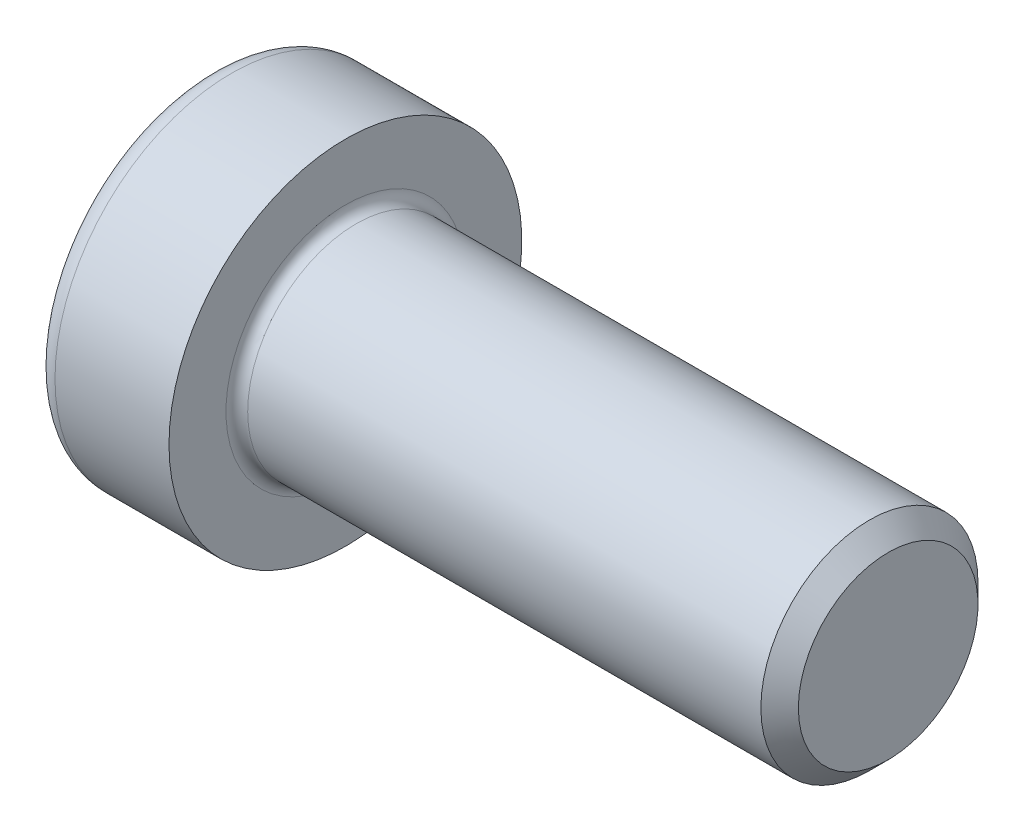
ISO-10303-21;
HEADER;
FILE_DESCRIPTION(('STEP AP214'),'2;1');
FILE_NAME('part.step','',(''),(''),'','','');
FILE_SCHEMA(('AUTOMOTIVE_DESIGN { 1 0 10303 214 1 1 1 1 }'));
ENDSEC;
DATA;
#1=APPLICATION_CONTEXT('core data for automotive mechanical design processes');
#2=APPLICATION_PROTOCOL_DEFINITION('international standard','automotive_design',2000,#1);
#3=PRODUCT_CONTEXT('',#1,'mechanical');
#4=PRODUCT('Part','Part','',(#3));
#5=PRODUCT_RELATED_PRODUCT_CATEGORY('part','',(#4));
#6=PRODUCT_DEFINITION_FORMATION('','',#4);
#7=PRODUCT_DEFINITION_CONTEXT('part definition',#1,'design');
#8=PRODUCT_DEFINITION('design','',#6,#7);
#9=PRODUCT_DEFINITION_SHAPE('','',#8);
#10=(LENGTH_UNIT() NAMED_UNIT(*) SI_UNIT(.MILLI.,.METRE.));
#11=(NAMED_UNIT(*) PLANE_ANGLE_UNIT() SI_UNIT($,.RADIAN.));
#12=(NAMED_UNIT(*) SI_UNIT($,.STERADIAN.) SOLID_ANGLE_UNIT());
#13=UNCERTAINTY_MEASURE_WITH_UNIT(LENGTH_MEASURE(1.E-05),#10,'distance_accuracy_value','');
#14=(GEOMETRIC_REPRESENTATION_CONTEXT(3) GLOBAL_UNCERTAINTY_ASSIGNED_CONTEXT((#13)) GLOBAL_UNIT_ASSIGNED_CONTEXT((#10,
#11,#12)) REPRESENTATION_CONTEXT('',''));
#15=CARTESIAN_POINT('',(0.,0.,0.));
#16=DIRECTION('',(0.,0.,1.));
#17=DIRECTION('',(1.,0.,0.));
#18=AXIS2_PLACEMENT_3D('',#15,#16,#17);
#19=CARTESIAN_POINT('',(0.,0.,0.));
#20=DIRECTION('',(-1.,0.,0.));
#21=DIRECTION('',(0.,0.,1.));
#22=AXIS2_PLACEMENT_3D('',#19,#20,#21);
#23=PLANE('',#22);
#24=DIRECTION('',(0.,-0.499999999999998,0.86602540378444));
#25=VECTOR('',#24,1.);
#26=CARTESIAN_POINT('',(0.,2.88675134594813,0.));
#27=LINE('',#26,#25);
#28=CARTESIAN_POINT('',(0.,2.88675134594813,0.));
#29=VERTEX_POINT('',#28);
#30=CARTESIAN_POINT('',(0.,1.44337567297407,2.49999999999999));
#31=VERTEX_POINT('',#30);
#32=EDGE_CURVE('E296',#29,#31,#27,.T.);
#33=ORIENTED_EDGE('',*,*,#32,.T.);
#34=DIRECTION('',(0.,1.,0.));
#35=VECTOR('',#34,1.);
#36=CARTESIAN_POINT('',(0.,-1.44337567297405,2.5));
#37=LINE('',#36,#35);
#38=CARTESIAN_POINT('',(0.,-1.44337567297405,2.5));
#39=VERTEX_POINT('',#38);
#40=EDGE_CURVE('E150',#39,#31,#37,.T.);
#41=ORIENTED_EDGE('',*,*,#40,.F.);
#42=DIRECTION('',(0.,-0.500000000000001,-0.866025403784438));
#43=VECTOR('',#42,1.);
#44=CARTESIAN_POINT('',(0.,-1.44337567297405,2.5));
#45=LINE('',#44,#43);
#46=CARTESIAN_POINT('',(0.,-2.88675134594812,0.));
#47=VERTEX_POINT('',#46);
#48=EDGE_CURVE('E301',#39,#47,#45,.T.);
#49=ORIENTED_EDGE('',*,*,#48,.T.);
#50=DIRECTION('',(0.,0.499999999999998,-0.86602540378444));
#51=VECTOR('',#50,1.);
#52=CARTESIAN_POINT('',(0.,-2.88675134594812,0.));
#53=LINE('',#52,#51);
#54=CARTESIAN_POINT('',(0.,-1.44337567297406,-2.5));
#55=VERTEX_POINT('',#54);
#56=EDGE_CURVE('E305',#47,#55,#53,.T.);
#57=ORIENTED_EDGE('',*,*,#56,.T.);
#58=DIRECTION('',(0.,-1.,0.));
#59=VECTOR('',#58,1.);
#60=CARTESIAN_POINT('',(0.,1.44337567297407,-2.50000000000001));
#61=LINE('',#60,#59);
#62=CARTESIAN_POINT('',(0.,1.44337567297407,-2.50000000000001));
#63=VERTEX_POINT('',#62);
#64=EDGE_CURVE('E309',#63,#55,#61,.T.);
#65=ORIENTED_EDGE('',*,*,#64,.F.);
#66=DIRECTION('',(0.,-0.500000000000001,-0.866025403784438));
#67=VECTOR('',#66,1.);
#68=CARTESIAN_POINT('',(0.,2.88675134594813,0.));
#69=LINE('',#68,#67);
#70=EDGE_CURVE('E145',#29,#63,#69,.T.);
#71=ORIENTED_EDGE('',*,*,#70,.F.);
#72=EDGE_LOOP('',(#33,#41,#49,#57,#65,#71));
#73=FACE_BOUND('',#72,.T.);
#74=CARTESIAN_POINT('',(0.,0.,0.));
#75=DIRECTION('',(-1.,0.,0.));
#76=DIRECTION('',(0.,0.,1.));
#77=AXIS2_PLACEMENT_3D('',#74,#75,#76);
#78=CIRCLE('',#77,5.7);
#79=CARTESIAN_POINT('',(0.,0.,5.7));
#80=VERTEX_POINT('',#79);
#81=EDGE_CURVE('E60',#80,#80,#78,.T.);
#82=ORIENTED_EDGE('',*,*,#81,.T.);
#83=EDGE_LOOP('',(#82));
#84=FACE_BOUND('',#83,.T.);
#85=ADVANCED_FACE('F51',(#73,#84),#23,.T.);
#86=CARTESIAN_POINT('',(-31.75,0.,0.));
#87=DIRECTION('',(-1.,0.,0.));
#88=DIRECTION('',(0.,0.,1.));
#89=AXIS2_PLACEMENT_3D('',#86,#87,#88);
#90=CYLINDRICAL_SURFACE('',#89,6.5);
#91=CARTESIAN_POINT('',(0.800000000000002,0.,0.));
#92=DIRECTION('',(-1.,0.,0.));
#93=DIRECTION('',(0.,0.,1.));
#94=AXIS2_PLACEMENT_3D('',#91,#92,#93);
#95=CIRCLE('',#94,6.5);
#96=CARTESIAN_POINT('',(0.800000000000002,0.,6.5));
#97=VERTEX_POINT('',#96);
#98=EDGE_CURVE('E11',#97,#97,#95,.F.);
#99=ORIENTED_EDGE('',*,*,#98,.T.);
#100=EDGE_LOOP('',(#99));
#101=FACE_BOUND('',#100,.T.);
#102=CARTESIAN_POINT('',(5.,0.,0.));
#103=DIRECTION('',(-1.,0.,0.));
#104=DIRECTION('',(0.,0.,1.));
#105=AXIS2_PLACEMENT_3D('',#102,#103,#104);
#106=CIRCLE('',#105,6.5);
#107=CARTESIAN_POINT('',(5.,0.,6.5));
#108=VERTEX_POINT('',#107);
#109=EDGE_CURVE('E175',#108,#108,#106,.T.);
#110=ORIENTED_EDGE('',*,*,#109,.T.);
#111=EDGE_LOOP('',(#110));
#112=FACE_BOUND('',#111,.T.);
#113=ADVANCED_FACE('F204',(#101,#112),#90,.T.);
#114=CARTESIAN_POINT('',(5.,6.5,0.));
#115=DIRECTION('',(1.,0.,0.));
#116=DIRECTION('',(0.,0.,-1.));
#117=AXIS2_PLACEMENT_3D('',#114,#115,#116);
#118=PLANE('',#117);
#119=CARTESIAN_POINT('',(5.,0.,0.));
#120=DIRECTION('',(1.,0.,0.));
#121=DIRECTION('',(0.,0.,-1.));
#122=AXIS2_PLACEMENT_3D('',#119,#120,#121);
#123=CIRCLE('',#122,4.39999999999989);
#124=CARTESIAN_POINT('',(5.,0.,-4.39999999999989));
#125=VERTEX_POINT('',#124);
#126=EDGE_CURVE('E179',#125,#125,#123,.F.);
#127=ORIENTED_EDGE('',*,*,#126,.T.);
#128=EDGE_LOOP('',(#127));
#129=FACE_BOUND('',#128,.T.);
#130=ORIENTED_EDGE('',*,*,#109,.F.);
#131=EDGE_LOOP('',(#130));
#132=FACE_BOUND('',#131,.T.);
#133=ADVANCED_FACE('F210',(#129,#132),#118,.T.);
#134=CARTESIAN_POINT('',(-31.75,0.,0.));
#135=DIRECTION('',(-1.,0.,0.));
#136=DIRECTION('',(0.,0.,1.));
#137=AXIS2_PLACEMENT_3D('',#134,#135,#136);
#138=CYLINDRICAL_SURFACE('',#137,3.99999999999989);
#139=CARTESIAN_POINT('',(5.4,0.,0.));
#140=DIRECTION('',(1.,0.,0.));
#141=DIRECTION('',(0.,0.,-1.));
#142=AXIS2_PLACEMENT_3D('',#139,#140,#141);
#143=CIRCLE('',#142,3.99999999999989);
#144=CARTESIAN_POINT('',(5.4,0.,-3.99999999999989));
#145=VERTEX_POINT('',#144);
#146=EDGE_CURVE('E183',#145,#145,#143,.T.);
#147=ORIENTED_EDGE('',*,*,#146,.T.);
#148=EDGE_LOOP('',(#147));
#149=FACE_BOUND('',#148,.T.);
#150=CARTESIAN_POINT('',(24.3094999999998,0.,0.));
#151=DIRECTION('',(-1.,0.,0.));
#152=DIRECTION('',(0.,0.,1.));
#153=AXIS2_PLACEMENT_3D('',#150,#151,#152);
#154=CIRCLE('',#153,3.99999999999978);
#155=CARTESIAN_POINT('',(24.3094999999998,0.,3.99999999999978));
#156=VERTEX_POINT('',#155);
#157=EDGE_CURVE('E171',#156,#156,#154,.T.);
#158=ORIENTED_EDGE('',*,*,#157,.T.);
#159=EDGE_LOOP('',(#158));
#160=FACE_BOUND('',#159,.T.);
#161=ADVANCED_FACE('F216',(#149,#160),#138,.T.);
#162=CARTESIAN_POINT('',(25.,0.,0.));
#163=DIRECTION('',(-1.,0.,0.));
#164=DIRECTION('',(0.,0.,1.));
#165=AXIS2_PLACEMENT_3D('',#162,#163,#164);
#166=CONICAL_SURFACE('',#165,3.3095,0.785398163397146);
#167=ORIENTED_EDGE('',*,*,#157,.F.);
#168=EDGE_LOOP('',(#167));
#169=FACE_BOUND('',#168,.T.);
#170=CARTESIAN_POINT('',(25.,0.,0.));
#171=DIRECTION('',(-1.,0.,0.));
#172=DIRECTION('',(0.,0.,1.));
#173=AXIS2_PLACEMENT_3D('',#170,#171,#172);
#174=CIRCLE('',#173,3.3095);
#175=CARTESIAN_POINT('',(25.,0.,3.3095));
#176=VERTEX_POINT('',#175);
#177=EDGE_CURVE('E166',#176,#176,#174,.T.);
#178=ORIENTED_EDGE('',*,*,#177,.T.);
#179=EDGE_LOOP('',(#178));
#180=FACE_BOUND('',#179,.T.);
#181=ADVANCED_FACE('F220',(#169,#180),#166,.T.);
#182=CARTESIAN_POINT('',(25.,3.3095,0.));
#183=DIRECTION('',(1.,0.,0.));
#184=DIRECTION('',(0.,0.,-1.));
#185=AXIS2_PLACEMENT_3D('',#182,#183,#184);
#186=PLANE('',#185);
#187=ORIENTED_EDGE('',*,*,#177,.F.);
#188=EDGE_LOOP('',(#187));
#189=FACE_BOUND('',#188,.T.);
#190=ADVANCED_FACE('F200',(#189),#186,.T.);
#191=CARTESIAN_POINT('',(5.4,0.,0.));
#192=DIRECTION('',(1.,0.,0.));
#193=DIRECTION('',(0.,0.,-1.));
#194=AXIS2_PLACEMENT_3D('',#191,#192,#193);
#195=TOROIDAL_SURFACE('',#194,4.39999999999989,0.4);
#196=ORIENTED_EDGE('',*,*,#146,.F.);
#197=EDGE_LOOP('',(#196));
#198=FACE_BOUND('',#197,.T.);
#199=ORIENTED_EDGE('',*,*,#126,.F.);
#200=EDGE_LOOP('',(#199));
#201=FACE_BOUND('',#200,.T.);
#202=ADVANCED_FACE('F193',(#198,#201),#195,.F.);
#203=CARTESIAN_POINT('',(0.800000000000002,0.,0.));
#204=DIRECTION('',(-1.,0.,0.));
#205=DIRECTION('',(0.,0.,1.));
#206=AXIS2_PLACEMENT_3D('',#203,#204,#205);
#207=TOROIDAL_SURFACE('',#206,5.7,0.8);
#208=ORIENTED_EDGE('',*,*,#98,.F.);
#209=EDGE_LOOP('',(#208));
#210=FACE_BOUND('',#209,.T.);
#211=ORIENTED_EDGE('',*,*,#81,.F.);
#212=EDGE_LOOP('',(#211));
#213=FACE_BOUND('',#212,.T.);
#214=ADVANCED_FACE('F53',(#210,#213),#207,.T.);
#215=CARTESIAN_POINT('',(3.8,2.88675134594813,0.));
#216=DIRECTION('',(0.,-0.86602540378444,-0.499999999999998));
#217=DIRECTION('',(0.,0.499999999999998,-0.86602540378444));
#218=AXIS2_PLACEMENT_3D('',#215,#216,#217);
#219=PLANE('',#218);
#220=ORIENTED_EDGE('',*,*,#32,.F.);
#221=DIRECTION('',(-1.,0.,0.));
#222=VECTOR('',#221,1.);
#223=CARTESIAN_POINT('',(3.8,2.88675134594813,0.));
#224=LINE('',#223,#222);
#225=CARTESIAN_POINT('',(3.8,2.88675134594813,0.));
#226=VERTEX_POINT('',#225);
#227=EDGE_CURVE('E282',#226,#29,#224,.T.);
#228=ORIENTED_EDGE('',*,*,#227,.F.);
#229=DIRECTION('',(0.,-0.499999999999998,0.86602540378444));
#230=VECTOR('',#229,1.);
#231=CARTESIAN_POINT('',(3.8,2.88675134594813,0.));
#232=LINE('',#231,#230);
#233=CARTESIAN_POINT('',(3.8,2.1650635094611,1.24999999999999));
#234=VERTEX_POINT('',#233);
#235=EDGE_CURVE('E136',#226,#234,#232,.T.);
#236=ORIENTED_EDGE('',*,*,#235,.T.);
#237=CARTESIAN_POINT('',(3.8,1.44337567297407,2.49999999999999));
#238=VERTEX_POINT('',#237);
#239=EDGE_CURVE('E126',#234,#238,#232,.T.);
#240=ORIENTED_EDGE('',*,*,#239,.T.);
#241=DIRECTION('',(-1.,0.,0.));
#242=VECTOR('',#241,1.);
#243=CARTESIAN_POINT('',(3.8,1.44337567297407,2.49999999999999));
#244=LINE('',#243,#242);
#245=EDGE_CURVE('E141',#238,#31,#244,.T.);
#246=ORIENTED_EDGE('',*,*,#245,.T.);
#247=EDGE_LOOP('',(#220,#228,#236,#240,#246));
#248=FACE_BOUND('',#247,.T.);
#249=ADVANCED_FACE('F140',(#248),#219,.T.);
#250=CARTESIAN_POINT('',(3.8,-1.44337567297405,2.5));
#251=DIRECTION('',(0.,0.,1.));
#252=DIRECTION('',(0.,-1.,0.));
#253=AXIS2_PLACEMENT_3D('',#250,#251,#252);
#254=PLANE('',#253);
#255=ORIENTED_EDGE('',*,*,#40,.T.);
#256=ORIENTED_EDGE('',*,*,#245,.F.);
#257=DIRECTION('',(0.,1.,0.));
#258=VECTOR('',#257,1.);
#259=CARTESIAN_POINT('',(3.8,-1.44337567297405,2.5));
#260=LINE('',#259,#258);
#261=CARTESIAN_POINT('',(3.8,0.,2.49999999999999));
#262=VERTEX_POINT('',#261);
#263=EDGE_CURVE('E123',#262,#238,#260,.T.);
#264=ORIENTED_EDGE('',*,*,#263,.F.);
#265=CARTESIAN_POINT('',(3.8,-1.44337567297405,2.5));
#266=VERTEX_POINT('',#265);
#267=EDGE_CURVE('E135',#266,#262,#260,.T.);
#268=ORIENTED_EDGE('',*,*,#267,.F.);
#269=DIRECTION('',(-1.,0.,0.));
#270=VECTOR('',#269,1.);
#271=CARTESIAN_POINT('',(3.8,-1.44337567297405,2.5));
#272=LINE('',#271,#270);
#273=EDGE_CURVE('E153',#266,#39,#272,.T.);
#274=ORIENTED_EDGE('',*,*,#273,.T.);
#275=EDGE_LOOP('',(#255,#256,#264,#268,#274));
#276=FACE_BOUND('',#275,.T.);
#277=ADVANCED_FACE('F147',(#276),#254,.F.);
#278=CARTESIAN_POINT('',(3.8,-1.44337567297405,2.5));
#279=DIRECTION('',(0.,0.866025403784438,-0.500000000000001));
#280=DIRECTION('',(0.,0.500000000000001,0.866025403784438));
#281=AXIS2_PLACEMENT_3D('',#278,#279,#280);
#282=PLANE('',#281);
#283=ORIENTED_EDGE('',*,*,#48,.F.);
#284=ORIENTED_EDGE('',*,*,#273,.F.);
#285=DIRECTION('',(0.,-0.500000000000001,-0.866025403784438));
#286=VECTOR('',#285,1.);
#287=CARTESIAN_POINT('',(3.8,-1.44337567297405,2.5));
#288=LINE('',#287,#286);
#289=CARTESIAN_POINT('',(3.8,-2.16506350946108,1.25));
#290=VERTEX_POINT('',#289);
#291=EDGE_CURVE('E344',#266,#290,#288,.T.);
#292=ORIENTED_EDGE('',*,*,#291,.T.);
#293=CARTESIAN_POINT('',(3.8,-2.88675134594812,0.));
#294=VERTEX_POINT('',#293);
#295=EDGE_CURVE('E324',#290,#294,#288,.T.);
#296=ORIENTED_EDGE('',*,*,#295,.T.);
#297=DIRECTION('',(-1.,0.,0.));
#298=VECTOR('',#297,1.);
#299=CARTESIAN_POINT('',(3.8,-2.88675134594812,0.));
#300=LINE('',#299,#298);
#301=EDGE_CURVE('E161',#294,#47,#300,.T.);
#302=ORIENTED_EDGE('',*,*,#301,.T.);
#303=EDGE_LOOP('',(#283,#284,#292,#296,#302));
#304=FACE_BOUND('',#303,.T.);
#305=ADVANCED_FACE('F234',(#304),#282,.T.);
#306=CARTESIAN_POINT('',(3.8,-2.88675134594812,0.));
#307=DIRECTION('',(0.,0.86602540378444,0.499999999999998));
#308=DIRECTION('',(0.,-0.499999999999998,0.86602540378444));
#309=AXIS2_PLACEMENT_3D('',#306,#307,#308);
#310=PLANE('',#309);
#311=ORIENTED_EDGE('',*,*,#56,.F.);
#312=ORIENTED_EDGE('',*,*,#301,.F.);
#313=DIRECTION('',(0.,0.499999999999998,-0.86602540378444));
#314=VECTOR('',#313,1.);
#315=CARTESIAN_POINT('',(3.8,-2.88675134594812,0.));
#316=LINE('',#315,#314);
#317=CARTESIAN_POINT('',(3.8,-2.1650635094611,-1.24999999999999));
#318=VERTEX_POINT('',#317);
#319=EDGE_CURVE('E291',#294,#318,#316,.T.);
#320=ORIENTED_EDGE('',*,*,#319,.T.);
#321=CARTESIAN_POINT('',(3.8,-1.44337567297406,-2.5));
#322=VERTEX_POINT('',#321);
#323=EDGE_CURVE('E342',#318,#322,#316,.T.);
#324=ORIENTED_EDGE('',*,*,#323,.T.);
#325=DIRECTION('',(-1.,0.,0.));
#326=VECTOR('',#325,1.);
#327=CARTESIAN_POINT('',(3.8,-1.44337567297406,-2.5));
#328=LINE('',#327,#326);
#329=EDGE_CURVE('E281',#322,#55,#328,.T.);
#330=ORIENTED_EDGE('',*,*,#329,.T.);
#331=EDGE_LOOP('',(#311,#312,#320,#324,#330));
#332=FACE_BOUND('',#331,.T.);
#333=ADVANCED_FACE('F237',(#332),#310,.T.);
#334=CARTESIAN_POINT('',(3.8,1.44337567297407,-2.50000000000001));
#335=DIRECTION('',(0.,0.,-1.));
#336=DIRECTION('',(0.,1.,0.));
#337=AXIS2_PLACEMENT_3D('',#334,#335,#336);
#338=PLANE('',#337);
#339=ORIENTED_EDGE('',*,*,#64,.T.);
#340=ORIENTED_EDGE('',*,*,#329,.F.);
#341=DIRECTION('',(0.,-1.,0.));
#342=VECTOR('',#341,1.);
#343=CARTESIAN_POINT('',(3.8,1.44337567297407,-2.50000000000001));
#344=LINE('',#343,#342);
#345=CARTESIAN_POINT('',(3.8,0.,-2.5));
#346=VERTEX_POINT('',#345);
#347=EDGE_CURVE('E285',#346,#322,#344,.T.);
#348=ORIENTED_EDGE('',*,*,#347,.F.);
#349=CARTESIAN_POINT('',(3.8,1.44337567297407,-2.50000000000001));
#350=VERTEX_POINT('',#349);
#351=EDGE_CURVE('E67',#350,#346,#344,.T.);
#352=ORIENTED_EDGE('',*,*,#351,.F.);
#353=DIRECTION('',(-1.,0.,0.));
#354=VECTOR('',#353,1.);
#355=CARTESIAN_POINT('',(3.8,1.44337567297407,-2.50000000000001));
#356=LINE('',#355,#354);
#357=EDGE_CURVE('E277',#350,#63,#356,.T.);
#358=ORIENTED_EDGE('',*,*,#357,.T.);
#359=EDGE_LOOP('',(#339,#340,#348,#352,#358));
#360=FACE_BOUND('',#359,.T.);
#361=ADVANCED_FACE('F241',(#360),#338,.F.);
#362=CARTESIAN_POINT('',(3.8,2.88675134594813,0.));
#363=DIRECTION('',(0.,0.866025403784438,-0.500000000000001));
#364=DIRECTION('',(0.,0.500000000000001,0.866025403784438));
#365=AXIS2_PLACEMENT_3D('',#362,#363,#364);
#366=PLANE('',#365);
#367=ORIENTED_EDGE('',*,*,#70,.T.);
#368=ORIENTED_EDGE('',*,*,#357,.F.);
#369=DIRECTION('',(0.,-0.500000000000001,-0.866025403784438));
#370=VECTOR('',#369,1.);
#371=CARTESIAN_POINT('',(3.8,2.88675134594813,0.));
#372=LINE('',#371,#370);
#373=CARTESIAN_POINT('',(3.8,2.1650635094611,-1.25000000000001));
#374=VERTEX_POINT('',#373);
#375=EDGE_CURVE('E266',#374,#350,#372,.T.);
#376=ORIENTED_EDGE('',*,*,#375,.F.);
#377=EDGE_CURVE('E273',#226,#374,#372,.T.);
#378=ORIENTED_EDGE('',*,*,#377,.F.);
#379=ORIENTED_EDGE('',*,*,#227,.T.);
#380=EDGE_LOOP('',(#367,#368,#376,#378,#379));
#381=FACE_BOUND('',#380,.T.);
#382=ADVANCED_FACE('F245',(#381),#366,.F.);
#383=CARTESIAN_POINT('',(3.8,4.33012701892219,-2.50000000000001));
#384=DIRECTION('',(1.,0.,0.));
#385=DIRECTION('',(0.,0.,-1.));
#386=AXIS2_PLACEMENT_3D('',#383,#384,#385);
#387=PLANE('',#386);
#388=ORIENTED_EDGE('',*,*,#347,.T.);
#389=ORIENTED_EDGE('',*,*,#323,.F.);
#390=CARTESIAN_POINT('',(3.8,0.,0.));
#391=DIRECTION('',(-1.,0.,0.));
#392=DIRECTION('',(0.,0.,1.));
#393=AXIS2_PLACEMENT_3D('',#390,#391,#392);
#394=CIRCLE('',#393,2.5);
#395=EDGE_CURVE('E333',#346,#318,#394,.T.);
#396=ORIENTED_EDGE('',*,*,#395,.F.);
#397=EDGE_LOOP('',(#388,#389,#396));
#398=FACE_BOUND('',#397,.T.);
#399=ADVANCED_FACE('F249',(#398),#387,.F.);
#400=ORIENTED_EDGE('',*,*,#319,.F.);
#401=ORIENTED_EDGE('',*,*,#295,.F.);
#402=EDGE_CURVE('E159',#318,#290,#394,.T.);
#403=ORIENTED_EDGE('',*,*,#402,.F.);
#404=EDGE_LOOP('',(#400,#401,#403));
#405=FACE_BOUND('',#404,.T.);
#406=ADVANCED_FACE('F252',(#405),#387,.F.);
#407=ORIENTED_EDGE('',*,*,#291,.F.);
#408=ORIENTED_EDGE('',*,*,#267,.T.);
#409=EDGE_CURVE('E152',#290,#262,#394,.T.);
#410=ORIENTED_EDGE('',*,*,#409,.F.);
#411=EDGE_LOOP('',(#407,#408,#410));
#412=FACE_BOUND('',#411,.T.);
#413=ADVANCED_FACE('F257',(#412),#387,.F.);
#414=ORIENTED_EDGE('',*,*,#263,.T.);
#415=ORIENTED_EDGE('',*,*,#239,.F.);
#416=EDGE_CURVE('E129',#262,#234,#394,.T.);
#417=ORIENTED_EDGE('',*,*,#416,.F.);
#418=EDGE_LOOP('',(#414,#415,#417));
#419=FACE_BOUND('',#418,.T.);
#420=ADVANCED_FACE('F125',(#419),#387,.F.);
#421=ORIENTED_EDGE('',*,*,#235,.F.);
#422=ORIENTED_EDGE('',*,*,#377,.T.);
#423=EDGE_CURVE('E167',#234,#374,#394,.T.);
#424=ORIENTED_EDGE('',*,*,#423,.F.);
#425=EDGE_LOOP('',(#421,#422,#424));
#426=FACE_BOUND('',#425,.T.);
#427=ADVANCED_FACE('F260',(#426),#387,.F.);
#428=ORIENTED_EDGE('',*,*,#375,.T.);
#429=ORIENTED_EDGE('',*,*,#351,.T.);
#430=EDGE_CURVE('E269',#374,#346,#394,.T.);
#431=ORIENTED_EDGE('',*,*,#430,.F.);
#432=EDGE_LOOP('',(#428,#429,#431));
#433=FACE_BOUND('',#432,.T.);
#434=ADVANCED_FACE('F230',(#433),#387,.F.);
#435=CARTESIAN_POINT('',(3.8,0.,0.));
#436=DIRECTION('',(-1.,0.,0.));
#437=DIRECTION('',(0.,0.,1.));
#438=AXIS2_PLACEMENT_3D('',#435,#436,#437);
#439=CONICAL_SURFACE('',#438,2.5,1.04719755119659);
#440=CARTESIAN_POINT('',(5.24337567297407,0.,0.));
#441=VERTEX_POINT('',#440);
#442=VERTEX_LOOP('',#441);
#443=FACE_BOUND('',#442,.T.);
#444=ORIENTED_EDGE('',*,*,#416,.T.);
#445=ORIENTED_EDGE('',*,*,#423,.T.);
#446=ORIENTED_EDGE('',*,*,#430,.T.);
#447=ORIENTED_EDGE('',*,*,#395,.T.);
#448=ORIENTED_EDGE('',*,*,#402,.T.);
#449=ORIENTED_EDGE('',*,*,#409,.T.);
#450=EDGE_LOOP('',(#444,#445,#446,#447,#448,#449));
#451=FACE_BOUND('',#450,.T.);
#452=ADVANCED_FACE('F228',(#443,#451),#439,.F.);
#453=CLOSED_SHELL('',(#85,#113,#133,#161,#181,#190,#202,#214,#249,#277,#305,#333,#361,#382,#399,
#406,#413,#420,#427,#434,#452));
#454=MANIFOLD_SOLID_BREP('B2',#453);
#455=ADVANCED_BREP_SHAPE_REPRESENTATION('',(#18,#454),#14);
#456=SHAPE_DEFINITION_REPRESENTATION(#9,#455);
ENDSEC;
END-ISO-10303-21;
